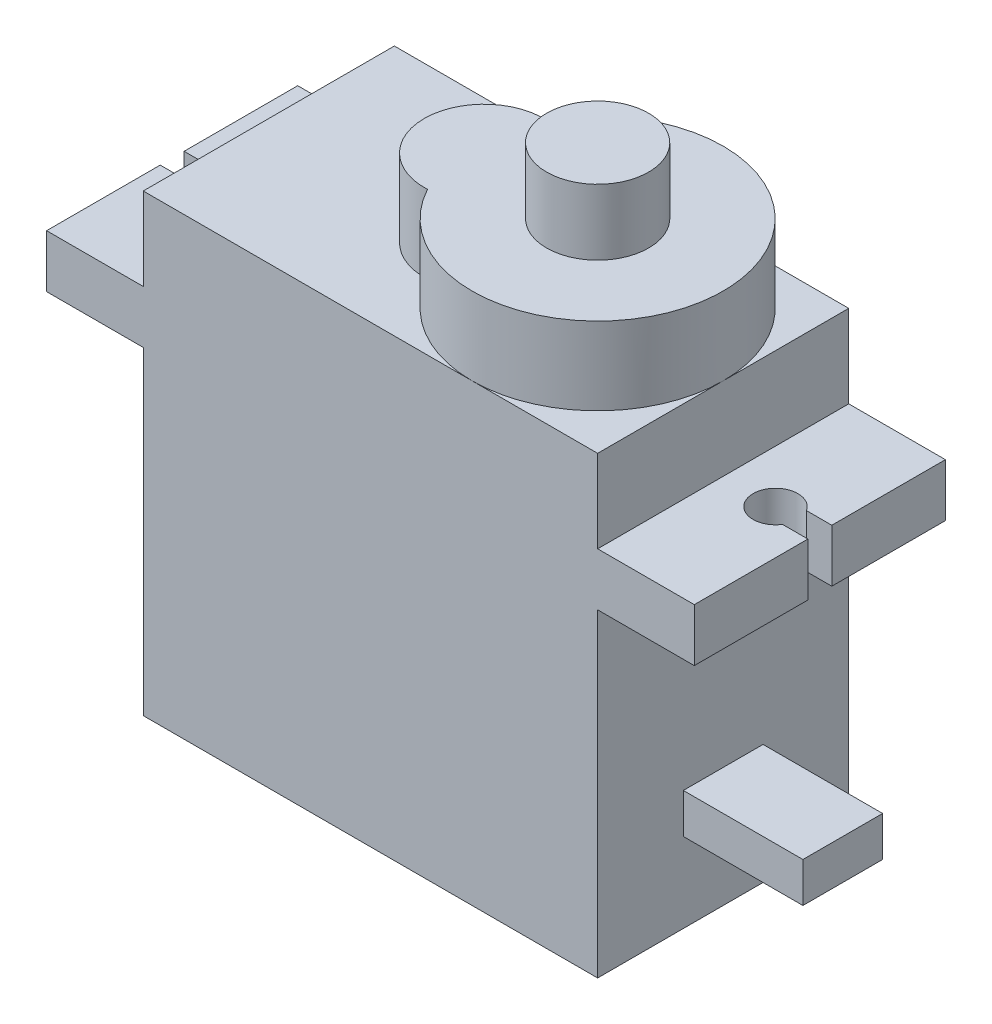
ISO-10303-21;
HEADER;
FILE_DESCRIPTION(('STEP AP214'),'2;1');
FILE_NAME('part.step','',(''),(''),'','','');
FILE_SCHEMA(('AUTOMOTIVE_DESIGN { 1 0 10303 214 1 1 1 1 }'));
ENDSEC;
DATA;
#1=APPLICATION_CONTEXT('core data for automotive mechanical design processes');
#2=APPLICATION_PROTOCOL_DEFINITION('international standard','automotive_design',2000,#1);
#3=PRODUCT_CONTEXT('',#1,'mechanical');
#4=PRODUCT('Part','Part','',(#3));
#5=PRODUCT_RELATED_PRODUCT_CATEGORY('part','',(#4));
#6=PRODUCT_DEFINITION_FORMATION('','',#4);
#7=PRODUCT_DEFINITION_CONTEXT('part definition',#1,'design');
#8=PRODUCT_DEFINITION('design','',#6,#7);
#9=PRODUCT_DEFINITION_SHAPE('','',#8);
#10=(LENGTH_UNIT() NAMED_UNIT(*) SI_UNIT(.MILLI.,.METRE.));
#11=(NAMED_UNIT(*) PLANE_ANGLE_UNIT() SI_UNIT($,.RADIAN.));
#12=(NAMED_UNIT(*) SI_UNIT($,.STERADIAN.) SOLID_ANGLE_UNIT());
#13=UNCERTAINTY_MEASURE_WITH_UNIT(LENGTH_MEASURE(1.E-05),#10,'distance_accuracy_value','');
#14=(GEOMETRIC_REPRESENTATION_CONTEXT(3) GLOBAL_UNCERTAINTY_ASSIGNED_CONTEXT((#13)) GLOBAL_UNIT_ASSIGNED_CONTEXT((#10,
#11,#12)) REPRESENTATION_CONTEXT('',''));
#15=CARTESIAN_POINT('',(0.,0.,0.));
#16=DIRECTION('',(0.,0.,1.));
#17=DIRECTION('',(1.,0.,0.));
#18=AXIS2_PLACEMENT_3D('',#15,#16,#17);
#19=CARTESIAN_POINT('',(11.4,16.,6.3));
#20=DIRECTION('',(-1.,0.,0.));
#21=DIRECTION('',(0.,-1.,0.));
#22=AXIS2_PLACEMENT_3D('',#19,#20,#21);
#23=PLANE('',#22);
#24=DIRECTION('',(0.,1.,0.));
#25=VECTOR('',#24,1.);
#26=CARTESIAN_POINT('',(11.4,16.,-6.3));
#27=LINE('',#26,#25);
#28=CARTESIAN_POINT('',(11.4,0.,-6.3));
#29=VERTEX_POINT('',#28);
#30=CARTESIAN_POINT('',(11.4,16.,-6.3));
#31=VERTEX_POINT('',#30);
#32=EDGE_CURVE('E363',#29,#31,#27,.T.);
#33=ORIENTED_EDGE('',*,*,#32,.T.);
#34=DIRECTION('',(0.,0.,-1.));
#35=VECTOR('',#34,1.);
#36=CARTESIAN_POINT('',(11.4,16.,6.3));
#37=LINE('',#36,#35);
#38=CARTESIAN_POINT('',(11.4,16.,6.3));
#39=VERTEX_POINT('',#38);
#40=EDGE_CURVE('E382',#39,#31,#37,.T.);
#41=ORIENTED_EDGE('',*,*,#40,.F.);
#42=DIRECTION('',(0.,1.,0.));
#43=VECTOR('',#42,1.);
#44=CARTESIAN_POINT('',(11.4,16.,6.3));
#45=LINE('',#44,#43);
#46=CARTESIAN_POINT('',(11.4,0.,6.3));
#47=VERTEX_POINT('',#46);
#48=EDGE_CURVE('E334',#47,#39,#45,.T.);
#49=ORIENTED_EDGE('',*,*,#48,.F.);
#50=DIRECTION('',(0.,0.,-1.));
#51=VECTOR('',#50,1.);
#52=CARTESIAN_POINT('',(11.4,0.,6.3));
#53=LINE('',#52,#51);
#54=EDGE_CURVE('E385',#47,#29,#53,.T.);
#55=ORIENTED_EDGE('',*,*,#54,.T.);
#56=EDGE_LOOP('',(#33,#41,#49,#55));
#57=FACE_BOUND('',#56,.T.);
#58=DIRECTION('',(0.,-1.,0.));
#59=VECTOR('',#58,1.);
#60=CARTESIAN_POINT('',(11.4,3.99999999999999,2.));
#61=LINE('',#60,#59);
#62=CARTESIAN_POINT('',(11.4,5.99999999999999,2.));
#63=VERTEX_POINT('',#62);
#64=CARTESIAN_POINT('',(11.4,3.99999999999999,2.));
#65=VERTEX_POINT('',#64);
#66=EDGE_CURVE('E238',#63,#65,#61,.T.);
#67=ORIENTED_EDGE('',*,*,#66,.F.);
#68=DIRECTION('',(0.,0.,1.));
#69=VECTOR('',#68,1.);
#70=CARTESIAN_POINT('',(11.4,5.99999999999999,2.));
#71=LINE('',#70,#69);
#72=CARTESIAN_POINT('',(11.4,5.99999999999999,-2.));
#73=VERTEX_POINT('',#72);
#74=EDGE_CURVE('E235',#73,#63,#71,.T.);
#75=ORIENTED_EDGE('',*,*,#74,.F.);
#76=DIRECTION('',(0.,1.,0.));
#77=VECTOR('',#76,1.);
#78=CARTESIAN_POINT('',(11.4,3.99999999999999,-2.));
#79=LINE('',#78,#77);
#80=CARTESIAN_POINT('',(11.4,3.99999999999999,-2.));
#81=VERTEX_POINT('',#80);
#82=EDGE_CURVE('E56',#81,#73,#79,.T.);
#83=ORIENTED_EDGE('',*,*,#82,.F.);
#84=DIRECTION('',(0.,0.,-1.));
#85=VECTOR('',#84,1.);
#86=CARTESIAN_POINT('',(11.4,3.99999999999999,2.));
#87=LINE('',#86,#85);
#88=EDGE_CURVE('E51',#65,#81,#87,.T.);
#89=ORIENTED_EDGE('',*,*,#88,.F.);
#90=EDGE_LOOP('',(#67,#75,#83,#89));
#91=FACE_BOUND('',#90,.T.);
#92=ADVANCED_FACE('F33',(#57,#91),#23,.F.);
#93=CARTESIAN_POINT('',(-16.25,18.65,6.3));
#94=DIRECTION('',(1.,0.,0.));
#95=DIRECTION('',(0.,0.,-1.));
#96=AXIS2_PLACEMENT_3D('',#93,#94,#95);
#97=PLANE('',#96);
#98=DIRECTION('',(0.,0.,-1.));
#99=VECTOR('',#98,1.);
#100=CARTESIAN_POINT('',(-16.25,18.65,6.3));
#101=LINE('',#100,#99);
#102=CARTESIAN_POINT('',(-16.25,18.65,6.3));
#103=VERTEX_POINT('',#102);
#104=CARTESIAN_POINT('',(-16.25,18.65,0.600000000000001));
#105=VERTEX_POINT('',#104);
#106=EDGE_CURVE('E399',#103,#105,#101,.T.);
#107=ORIENTED_EDGE('',*,*,#106,.T.);
#108=DIRECTION('',(0.,1.,0.));
#109=VECTOR('',#108,1.);
#110=CARTESIAN_POINT('',(-16.25,-0.00100000000000794,0.600000000000001));
#111=LINE('',#110,#109);
#112=CARTESIAN_POINT('',(-16.25,16.,0.600000000000001));
#113=VERTEX_POINT('',#112);
#114=EDGE_CURVE('E266',#113,#105,#111,.T.);
#115=ORIENTED_EDGE('',*,*,#114,.F.);
#116=DIRECTION('',(0.,0.,-1.));
#117=VECTOR('',#116,1.);
#118=CARTESIAN_POINT('',(-16.25,16.,6.3));
#119=LINE('',#118,#117);
#120=CARTESIAN_POINT('',(-16.25,16.,6.3));
#121=VERTEX_POINT('',#120);
#122=EDGE_CURVE('E395',#121,#113,#119,.T.);
#123=ORIENTED_EDGE('',*,*,#122,.F.);
#124=DIRECTION('',(0.,-1.,0.));
#125=VECTOR('',#124,1.);
#126=CARTESIAN_POINT('',(-16.25,18.65,6.3));
#127=LINE('',#126,#125);
#128=EDGE_CURVE('E326',#103,#121,#127,.T.);
#129=ORIENTED_EDGE('',*,*,#128,.F.);
#130=EDGE_LOOP('',(#107,#115,#123,#129));
#131=FACE_BOUND('',#130,.T.);
#132=ADVANCED_FACE('F521',(#131),#97,.F.);
#133=CARTESIAN_POINT('',(16.25,18.65,6.3));
#134=DIRECTION('',(-1.,0.,0.));
#135=DIRECTION('',(0.,0.,1.));
#136=AXIS2_PLACEMENT_3D('',#133,#134,#135);
#137=PLANE('',#136);
#138=DIRECTION('',(0.,0.,-1.));
#139=VECTOR('',#138,1.);
#140=CARTESIAN_POINT('',(16.25,18.65,6.3));
#141=LINE('',#140,#139);
#142=CARTESIAN_POINT('',(16.25,18.65,-0.6));
#143=VERTEX_POINT('',#142);
#144=CARTESIAN_POINT('',(16.25,18.65,-6.3));
#145=VERTEX_POINT('',#144);
#146=EDGE_CURVE('E374',#143,#145,#141,.T.);
#147=ORIENTED_EDGE('',*,*,#146,.F.);
#148=DIRECTION('',(0.,1.,0.));
#149=VECTOR('',#148,1.);
#150=CARTESIAN_POINT('',(16.25,-0.00100000000000794,-0.6));
#151=LINE('',#150,#149);
#152=CARTESIAN_POINT('',(16.25,16.,-0.6));
#153=VERTEX_POINT('',#152);
#154=EDGE_CURVE('E286',#153,#143,#151,.T.);
#155=ORIENTED_EDGE('',*,*,#154,.F.);
#156=DIRECTION('',(0.,0.,-1.));
#157=VECTOR('',#156,1.);
#158=CARTESIAN_POINT('',(16.25,16.,6.3));
#159=LINE('',#158,#157);
#160=CARTESIAN_POINT('',(16.25,16.,-6.3));
#161=VERTEX_POINT('',#160);
#162=EDGE_CURVE('E378',#153,#161,#159,.T.);
#163=ORIENTED_EDGE('',*,*,#162,.T.);
#164=DIRECTION('',(0.,1.,0.));
#165=VECTOR('',#164,1.);
#166=CARTESIAN_POINT('',(16.25,18.65,-6.3));
#167=LINE('',#166,#165);
#168=EDGE_CURVE('E368',#161,#145,#167,.T.);
#169=ORIENTED_EDGE('',*,*,#168,.T.);
#170=EDGE_LOOP('',(#147,#155,#163,#169));
#171=FACE_BOUND('',#170,.T.);
#172=ADVANCED_FACE('F437',(#171),#137,.F.);
#173=CARTESIAN_POINT('',(-11.4,22.8,6.3));
#174=DIRECTION('',(0.,-1.,0.));
#175=DIRECTION('',(0.,0.,-1.));
#176=AXIS2_PLACEMENT_3D('',#173,#174,#175);
#177=PLANE('',#176);
#178=CARTESIAN_POINT('',(-0.599999999999996,22.8,0.));
#179=DIRECTION('',(0.,1.,0.));
#180=DIRECTION('',(0.,0.,1.));
#181=AXIS2_PLACEMENT_3D('',#178,#179,#180);
#182=CIRCLE('',#181,3.);
#183=CARTESIAN_POINT('',(-0.442105263157892,22.8,-2.99584199384373));
#184=VERTEX_POINT('',#183);
#185=CARTESIAN_POINT('',(-0.442105263157893,22.8,2.99584199384372));
#186=VERTEX_POINT('',#185);
#187=EDGE_CURVE('E303',#184,#186,#182,.T.);
#188=ORIENTED_EDGE('',*,*,#187,.F.);
#189=CARTESIAN_POINT('',(5.1,22.8,0.));
#190=DIRECTION('',(0.,1.,0.));
#191=DIRECTION('',(0.,0.,1.));
#192=AXIS2_PLACEMENT_3D('',#189,#190,#191);
#193=CIRCLE('',#192,6.3);
#194=CARTESIAN_POINT('',(5.1,22.8,-6.3));
#195=VERTEX_POINT('',#194);
#196=EDGE_CURVE('E307',#195,#184,#193,.T.);
#197=ORIENTED_EDGE('',*,*,#196,.F.);
#198=DIRECTION('',(-1.,0.,0.));
#199=VECTOR('',#198,1.);
#200=CARTESIAN_POINT('',(-11.4,22.8,-6.3));
#201=LINE('',#200,#199);
#202=CARTESIAN_POINT('',(-11.4,22.8,-6.3));
#203=VERTEX_POINT('',#202);
#204=EDGE_CURVE('E345',#195,#203,#201,.T.);
#205=ORIENTED_EDGE('',*,*,#204,.T.);
#206=DIRECTION('',(0.,0.,-1.));
#207=VECTOR('',#206,1.);
#208=CARTESIAN_POINT('',(-11.4,22.8,6.3));
#209=LINE('',#208,#207);
#210=CARTESIAN_POINT('',(-11.4,22.8,6.3));
#211=VERTEX_POINT('',#210);
#212=EDGE_CURVE('E405',#211,#203,#209,.T.);
#213=ORIENTED_EDGE('',*,*,#212,.F.);
#214=DIRECTION('',(-1.,0.,0.));
#215=VECTOR('',#214,1.);
#216=CARTESIAN_POINT('',(-11.4,22.8,6.3));
#217=LINE('',#216,#215);
#218=CARTESIAN_POINT('',(5.1,22.8,6.3));
#219=VERTEX_POINT('',#218);
#220=EDGE_CURVE('E317',#219,#211,#217,.T.);
#221=ORIENTED_EDGE('',*,*,#220,.F.);
#222=EDGE_CURVE('E44',#186,#219,#193,.T.);
#223=ORIENTED_EDGE('',*,*,#222,.F.);
#224=EDGE_LOOP('',(#188,#197,#205,#213,#221,#223));
#225=FACE_BOUND('',#224,.T.);
#226=ADVANCED_FACE('F483',(#225),#177,.F.);
#227=CARTESIAN_POINT('',(11.4,22.8,0.));
#228=VERTEX_POINT('',#227);
#229=EDGE_CURVE('E11',#219,#228,#193,.T.);
#230=ORIENTED_EDGE('',*,*,#229,.F.);
#231=CARTESIAN_POINT('',(11.4,22.8,6.3));
#232=VERTEX_POINT('',#231);
#233=EDGE_CURVE('E319',#232,#219,#217,.T.);
#234=ORIENTED_EDGE('',*,*,#233,.F.);
#235=DIRECTION('',(0.,0.,-1.));
#236=VECTOR('',#235,1.);
#237=CARTESIAN_POINT('',(11.4,22.8,6.3));
#238=LINE('',#237,#236);
#239=EDGE_CURVE('E408',#232,#228,#238,.T.);
#240=ORIENTED_EDGE('',*,*,#239,.T.);
#241=EDGE_LOOP('',(#230,#234,#240));
#242=FACE_BOUND('',#241,.T.);
#243=ADVANCED_FACE('F493',(#242),#177,.F.);
#244=CARTESIAN_POINT('',(11.4,22.8,6.3));
#245=DIRECTION('',(-1.,0.,0.));
#246=DIRECTION('',(0.,-1.,0.));
#247=AXIS2_PLACEMENT_3D('',#244,#245,#246);
#248=PLANE('',#247);
#249=DIRECTION('',(0.,1.,0.));
#250=VECTOR('',#249,1.);
#251=CARTESIAN_POINT('',(11.4,22.8,-6.3));
#252=LINE('',#251,#250);
#253=CARTESIAN_POINT('',(11.4,18.65,-6.3));
#254=VERTEX_POINT('',#253);
#255=CARTESIAN_POINT('',(11.4,22.8,-6.3));
#256=VERTEX_POINT('',#255);
#257=EDGE_CURVE('E313',#254,#256,#252,.T.);
#258=ORIENTED_EDGE('',*,*,#257,.T.);
#259=EDGE_CURVE('E407',#228,#256,#238,.T.);
#260=ORIENTED_EDGE('',*,*,#259,.F.);
#261=ORIENTED_EDGE('',*,*,#239,.F.);
#262=DIRECTION('',(0.,1.,0.));
#263=VECTOR('',#262,1.);
#264=CARTESIAN_POINT('',(11.4,22.8,6.3));
#265=LINE('',#264,#263);
#266=CARTESIAN_POINT('',(11.4,18.65,6.3));
#267=VERTEX_POINT('',#266);
#268=EDGE_CURVE('E314',#267,#232,#265,.T.);
#269=ORIENTED_EDGE('',*,*,#268,.F.);
#270=DIRECTION('',(0.,0.,-1.));
#271=VECTOR('',#270,1.);
#272=CARTESIAN_POINT('',(11.4,18.65,6.3));
#273=LINE('',#272,#271);
#274=EDGE_CURVE('E342',#267,#254,#273,.T.);
#275=ORIENTED_EDGE('',*,*,#274,.T.);
#276=EDGE_LOOP('',(#258,#260,#261,#269,#275));
#277=FACE_BOUND('',#276,.T.);
#278=ADVANCED_FACE('F35',(#277),#248,.F.);
#279=EDGE_CURVE('E42',#228,#195,#193,.T.);
#280=ORIENTED_EDGE('',*,*,#279,.F.);
#281=ORIENTED_EDGE('',*,*,#259,.T.);
#282=EDGE_CURVE('E346',#256,#195,#201,.T.);
#283=ORIENTED_EDGE('',*,*,#282,.T.);
#284=EDGE_LOOP('',(#280,#281,#283));
#285=FACE_BOUND('',#284,.T.);
#286=ADVANCED_FACE('F416',(#285),#177,.F.);
#287=CARTESIAN_POINT('',(-11.4,22.8,6.3));
#288=DIRECTION('',(1.,0.,0.));
#289=DIRECTION('',(0.,1.,0.));
#290=AXIS2_PLACEMENT_3D('',#287,#288,#289);
#291=PLANE('',#290);
#292=DIRECTION('',(0.,-1.,0.));
#293=VECTOR('',#292,1.);
#294=CARTESIAN_POINT('',(-11.4,22.8,-6.3));
#295=LINE('',#294,#293);
#296=CARTESIAN_POINT('',(-11.4,18.65,-6.3));
#297=VERTEX_POINT('',#296);
#298=EDGE_CURVE('E349',#203,#297,#295,.T.);
#299=ORIENTED_EDGE('',*,*,#298,.T.);
#300=DIRECTION('',(0.,0.,-1.));
#301=VECTOR('',#300,1.);
#302=CARTESIAN_POINT('',(-11.4,18.65,6.3));
#303=LINE('',#302,#301);
#304=CARTESIAN_POINT('',(-11.4,18.65,6.3));
#305=VERTEX_POINT('',#304);
#306=EDGE_CURVE('E402',#305,#297,#303,.T.);
#307=ORIENTED_EDGE('',*,*,#306,.F.);
#308=DIRECTION('',(0.,-1.,0.));
#309=VECTOR('',#308,1.);
#310=CARTESIAN_POINT('',(-11.4,22.8,6.3));
#311=LINE('',#310,#309);
#312=EDGE_CURVE('E322',#211,#305,#311,.T.);
#313=ORIENTED_EDGE('',*,*,#312,.F.);
#314=ORIENTED_EDGE('',*,*,#212,.T.);
#315=EDGE_LOOP('',(#299,#307,#313,#314));
#316=FACE_BOUND('',#315,.T.);
#317=ADVANCED_FACE('F479',(#316),#291,.F.);
#318=CARTESIAN_POINT('',(-11.4,18.65,6.3));
#319=DIRECTION('',(0.,-1.,0.));
#320=DIRECTION('',(0.,0.,-1.));
#321=AXIS2_PLACEMENT_3D('',#318,#319,#320);
#322=PLANE('',#321);
#323=CARTESIAN_POINT('',(-14.025,18.65,0.));
#324=DIRECTION('',(0.,1.,0.));
#325=DIRECTION('',(0.,0.,1.));
#326=AXIS2_PLACEMENT_3D('',#323,#324,#325);
#327=CIRCLE('',#326,1.125);
#328=CARTESIAN_POINT('',(-14.9766433155337,18.65,0.600000000000001));
#329=VERTEX_POINT('',#328);
#330=CARTESIAN_POINT('',(-14.9766433155337,18.65,-0.6));
#331=VERTEX_POINT('',#330);
#332=EDGE_CURVE('E254',#329,#331,#327,.T.);
#333=ORIENTED_EDGE('',*,*,#332,.F.);
#334=DIRECTION('',(1.,0.,0.));
#335=VECTOR('',#334,1.);
#336=CARTESIAN_POINT('',(-14.9766433155337,18.65,0.600000000000001));
#337=LINE('',#336,#335);
#338=EDGE_CURVE('E259',#105,#329,#337,.T.);
#339=ORIENTED_EDGE('',*,*,#338,.F.);
#340=ORIENTED_EDGE('',*,*,#106,.F.);
#341=DIRECTION('',(-1.,0.,0.));
#342=VECTOR('',#341,1.);
#343=CARTESIAN_POINT('',(-11.4,18.65,6.3));
#344=LINE('',#343,#342);
#345=EDGE_CURVE('E324',#305,#103,#344,.T.);
#346=ORIENTED_EDGE('',*,*,#345,.F.);
#347=ORIENTED_EDGE('',*,*,#306,.T.);
#348=DIRECTION('',(-1.,0.,0.));
#349=VECTOR('',#348,1.);
#350=CARTESIAN_POINT('',(-11.4,18.65,-6.3));
#351=LINE('',#350,#349);
#352=CARTESIAN_POINT('',(-16.25,18.65,-6.3));
#353=VERTEX_POINT('',#352);
#354=EDGE_CURVE('E351',#297,#353,#351,.T.);
#355=ORIENTED_EDGE('',*,*,#354,.T.);
#356=CARTESIAN_POINT('',(-16.25,18.65,-0.6));
#357=VERTEX_POINT('',#356);
#358=EDGE_CURVE('E398',#357,#353,#101,.T.);
#359=ORIENTED_EDGE('',*,*,#358,.F.);
#360=DIRECTION('',(-1.,0.,0.));
#361=VECTOR('',#360,1.);
#362=CARTESIAN_POINT('',(-14.9766433155337,18.65,-0.6));
#363=LINE('',#362,#361);
#364=EDGE_CURVE('E257',#331,#357,#363,.T.);
#365=ORIENTED_EDGE('',*,*,#364,.F.);
#366=EDGE_LOOP('',(#333,#339,#340,#346,#347,#355,#359,#365));
#367=FACE_BOUND('',#366,.T.);
#368=ADVANCED_FACE('F473',(#367),#322,.F.);
#369=CARTESIAN_POINT('',(-16.25,16.,-0.6));
#370=VERTEX_POINT('',#369);
#371=CARTESIAN_POINT('',(-16.25,16.,-6.3));
#372=VERTEX_POINT('',#371);
#373=EDGE_CURVE('E394',#370,#372,#119,.T.);
#374=ORIENTED_EDGE('',*,*,#373,.F.);
#375=DIRECTION('',(0.,1.,0.));
#376=VECTOR('',#375,1.);
#377=CARTESIAN_POINT('',(-16.25,-0.00100000000000794,-0.6));
#378=LINE('',#377,#376);
#379=EDGE_CURVE('E268',#370,#357,#378,.T.);
#380=ORIENTED_EDGE('',*,*,#379,.T.);
#381=ORIENTED_EDGE('',*,*,#358,.T.);
#382=DIRECTION('',(0.,-1.,0.));
#383=VECTOR('',#382,1.);
#384=CARTESIAN_POINT('',(-16.25,18.65,-6.3));
#385=LINE('',#384,#383);
#386=EDGE_CURVE('E354',#353,#372,#385,.T.);
#387=ORIENTED_EDGE('',*,*,#386,.T.);
#388=EDGE_LOOP('',(#374,#380,#381,#387));
#389=FACE_BOUND('',#388,.T.);
#390=ADVANCED_FACE('F468',(#389),#97,.F.);
#391=CARTESIAN_POINT('',(-16.25,16.,6.3));
#392=DIRECTION('',(0.,1.,0.));
#393=DIRECTION('',(-1.,0.,0.));
#394=AXIS2_PLACEMENT_3D('',#391,#392,#393);
#395=PLANE('',#394);
#396=ORIENTED_EDGE('',*,*,#122,.T.);
#397=DIRECTION('',(-1.,0.,0.));
#398=VECTOR('',#397,1.);
#399=CARTESIAN_POINT('',(-14.9766433155337,16.,0.600000000000001));
#400=LINE('',#399,#398);
#401=CARTESIAN_POINT('',(-14.9766433155337,16.,0.600000000000001));
#402=VERTEX_POINT('',#401);
#403=EDGE_CURVE('E251',#402,#113,#400,.T.);
#404=ORIENTED_EDGE('',*,*,#403,.F.);
#405=CARTESIAN_POINT('',(-14.025,16.,0.));
#406=DIRECTION('',(0.,1.,0.));
#407=DIRECTION('',(-1.,0.,0.));
#408=AXIS2_PLACEMENT_3D('',#405,#406,#407);
#409=CIRCLE('',#408,1.125);
#410=CARTESIAN_POINT('',(-14.9766433155337,16.,-0.6));
#411=VERTEX_POINT('',#410);
#412=EDGE_CURVE('E248',#411,#402,#409,.F.);
#413=ORIENTED_EDGE('',*,*,#412,.F.);
#414=DIRECTION('',(1.,0.,0.));
#415=VECTOR('',#414,1.);
#416=CARTESIAN_POINT('',(-14.9766433155337,16.,-0.6));
#417=LINE('',#416,#415);
#418=EDGE_CURVE('E265',#370,#411,#417,.T.);
#419=ORIENTED_EDGE('',*,*,#418,.F.);
#420=ORIENTED_EDGE('',*,*,#373,.T.);
#421=DIRECTION('',(1.,0.,0.));
#422=VECTOR('',#421,1.);
#423=CARTESIAN_POINT('',(-16.25,16.,-6.3));
#424=LINE('',#423,#422);
#425=CARTESIAN_POINT('',(-11.4,16.,-6.3));
#426=VERTEX_POINT('',#425);
#427=EDGE_CURVE('E357',#372,#426,#424,.T.);
#428=ORIENTED_EDGE('',*,*,#427,.T.);
#429=DIRECTION('',(0.,0.,-1.));
#430=VECTOR('',#429,1.);
#431=CARTESIAN_POINT('',(-11.4,16.,6.3));
#432=LINE('',#431,#430);
#433=CARTESIAN_POINT('',(-11.4,16.,6.3));
#434=VERTEX_POINT('',#433);
#435=EDGE_CURVE('E391',#434,#426,#432,.T.);
#436=ORIENTED_EDGE('',*,*,#435,.F.);
#437=DIRECTION('',(1.,0.,0.));
#438=VECTOR('',#437,1.);
#439=CARTESIAN_POINT('',(-16.25,16.,6.3));
#440=LINE('',#439,#438);
#441=EDGE_CURVE('E328',#121,#434,#440,.T.);
#442=ORIENTED_EDGE('',*,*,#441,.F.);
#443=EDGE_LOOP('',(#396,#404,#413,#419,#420,#428,#436,#442));
#444=FACE_BOUND('',#443,.T.);
#445=ADVANCED_FACE('F462',(#444),#395,.F.);
#446=CARTESIAN_POINT('',(-11.4,16.,6.3));
#447=DIRECTION('',(1.,0.,0.));
#448=DIRECTION('',(0.,1.,0.));
#449=AXIS2_PLACEMENT_3D('',#446,#447,#448);
#450=PLANE('',#449);
#451=DIRECTION('',(0.,-1.,0.));
#452=VECTOR('',#451,1.);
#453=CARTESIAN_POINT('',(-11.4,16.,-6.3));
#454=LINE('',#453,#452);
#455=CARTESIAN_POINT('',(-11.4,0.,-6.3));
#456=VERTEX_POINT('',#455);
#457=EDGE_CURVE('E359',#426,#456,#454,.T.);
#458=ORIENTED_EDGE('',*,*,#457,.T.);
#459=DIRECTION('',(0.,0.,-1.));
#460=VECTOR('',#459,1.);
#461=CARTESIAN_POINT('',(-11.4,0.,6.3));
#462=LINE('',#461,#460);
#463=CARTESIAN_POINT('',(-11.4,0.,6.3));
#464=VERTEX_POINT('',#463);
#465=EDGE_CURVE('E388',#464,#456,#462,.T.);
#466=ORIENTED_EDGE('',*,*,#465,.F.);
#467=DIRECTION('',(0.,-1.,0.));
#468=VECTOR('',#467,1.);
#469=CARTESIAN_POINT('',(-11.4,16.,6.3));
#470=LINE('',#469,#468);
#471=EDGE_CURVE('E330',#434,#464,#470,.T.);
#472=ORIENTED_EDGE('',*,*,#471,.F.);
#473=ORIENTED_EDGE('',*,*,#435,.T.);
#474=EDGE_LOOP('',(#458,#466,#472,#473));
#475=FACE_BOUND('',#474,.T.);
#476=ADVANCED_FACE('F458',(#475),#450,.F.);
#477=CARTESIAN_POINT('',(11.4,0.,6.3));
#478=DIRECTION('',(0.,1.,0.));
#479=DIRECTION('',(0.,0.,1.));
#480=AXIS2_PLACEMENT_3D('',#477,#478,#479);
#481=PLANE('',#480);
#482=DIRECTION('',(1.,0.,0.));
#483=VECTOR('',#482,1.);
#484=CARTESIAN_POINT('',(11.4,0.,-6.3));
#485=LINE('',#484,#483);
#486=EDGE_CURVE('E361',#456,#29,#485,.T.);
#487=ORIENTED_EDGE('',*,*,#486,.T.);
#488=ORIENTED_EDGE('',*,*,#54,.F.);
#489=DIRECTION('',(1.,0.,0.));
#490=VECTOR('',#489,1.);
#491=CARTESIAN_POINT('',(11.4,0.,6.3));
#492=LINE('',#491,#490);
#493=EDGE_CURVE('E332',#464,#47,#492,.T.);
#494=ORIENTED_EDGE('',*,*,#493,.F.);
#495=ORIENTED_EDGE('',*,*,#465,.T.);
#496=EDGE_LOOP('',(#487,#488,#494,#495));
#497=FACE_BOUND('',#496,.T.);
#498=ADVANCED_FACE('F453',(#497),#481,.F.);
#499=CARTESIAN_POINT('',(16.25,16.,6.3));
#500=DIRECTION('',(0.,1.,0.));
#501=DIRECTION('',(-1.,0.,0.));
#502=AXIS2_PLACEMENT_3D('',#499,#500,#501);
#503=PLANE('',#502);
#504=ORIENTED_EDGE('',*,*,#162,.F.);
#505=DIRECTION('',(1.,0.,0.));
#506=VECTOR('',#505,1.);
#507=CARTESIAN_POINT('',(14.9766433155337,16.,-0.6));
#508=LINE('',#507,#506);
#509=CARTESIAN_POINT('',(14.9766433155337,16.,-0.6));
#510=VERTEX_POINT('',#509);
#511=EDGE_CURVE('E242',#510,#153,#508,.T.);
#512=ORIENTED_EDGE('',*,*,#511,.F.);
#513=CARTESIAN_POINT('',(14.025,16.,0.));
#514=DIRECTION('',(0.,1.,0.));
#515=DIRECTION('',(-1.,0.,0.));
#516=AXIS2_PLACEMENT_3D('',#513,#514,#515);
#517=CIRCLE('',#516,1.125);
#518=CARTESIAN_POINT('',(14.9766433155337,16.,0.600000000000001));
#519=VERTEX_POINT('',#518);
#520=EDGE_CURVE('E239',#519,#510,#517,.F.);
#521=ORIENTED_EDGE('',*,*,#520,.F.);
#522=DIRECTION('',(-1.,0.,0.));
#523=VECTOR('',#522,1.);
#524=CARTESIAN_POINT('',(14.9766433155337,16.,0.600000000000001));
#525=LINE('',#524,#523);
#526=CARTESIAN_POINT('',(16.25,16.,0.600000000000001));
#527=VERTEX_POINT('',#526);
#528=EDGE_CURVE('E252',#527,#519,#525,.T.);
#529=ORIENTED_EDGE('',*,*,#528,.F.);
#530=CARTESIAN_POINT('',(16.25,16.,6.3));
#531=VERTEX_POINT('',#530);
#532=EDGE_CURVE('E379',#531,#527,#159,.T.);
#533=ORIENTED_EDGE('',*,*,#532,.F.);
#534=DIRECTION('',(1.,0.,0.));
#535=VECTOR('',#534,1.);
#536=CARTESIAN_POINT('',(16.25,16.,6.3));
#537=LINE('',#536,#535);
#538=EDGE_CURVE('E336',#39,#531,#537,.T.);
#539=ORIENTED_EDGE('',*,*,#538,.F.);
#540=ORIENTED_EDGE('',*,*,#40,.T.);
#541=DIRECTION('',(1.,0.,0.));
#542=VECTOR('',#541,1.);
#543=CARTESIAN_POINT('',(16.25,16.,-6.3));
#544=LINE('',#543,#542);
#545=EDGE_CURVE('E365',#31,#161,#544,.T.);
#546=ORIENTED_EDGE('',*,*,#545,.T.);
#547=EDGE_LOOP('',(#504,#512,#521,#529,#533,#539,#540,#546));
#548=FACE_BOUND('',#547,.T.);
#549=ADVANCED_FACE('F442',(#548),#503,.F.);
#550=ORIENTED_EDGE('',*,*,#532,.T.);
#551=DIRECTION('',(0.,1.,0.));
#552=VECTOR('',#551,1.);
#553=CARTESIAN_POINT('',(16.25,-0.00100000000000794,0.600000000000001));
#554=LINE('',#553,#552);
#555=CARTESIAN_POINT('',(16.25,18.65,0.600000000000001));
#556=VERTEX_POINT('',#555);
#557=EDGE_CURVE('E288',#527,#556,#554,.T.);
#558=ORIENTED_EDGE('',*,*,#557,.T.);
#559=CARTESIAN_POINT('',(16.25,18.65,6.3));
#560=VERTEX_POINT('',#559);
#561=EDGE_CURVE('E375',#560,#556,#141,.T.);
#562=ORIENTED_EDGE('',*,*,#561,.F.);
#563=DIRECTION('',(0.,1.,0.));
#564=VECTOR('',#563,1.);
#565=CARTESIAN_POINT('',(16.25,18.65,6.3));
#566=LINE('',#565,#564);
#567=EDGE_CURVE('E338',#531,#560,#566,.T.);
#568=ORIENTED_EDGE('',*,*,#567,.F.);
#569=EDGE_LOOP('',(#550,#558,#562,#568));
#570=FACE_BOUND('',#569,.T.);
#571=ADVANCED_FACE('F499',(#570),#137,.F.);
#572=CARTESIAN_POINT('',(11.4,18.65,6.3));
#573=DIRECTION('',(0.,-1.,0.));
#574=DIRECTION('',(0.,0.,-1.));
#575=AXIS2_PLACEMENT_3D('',#572,#573,#574);
#576=PLANE('',#575);
#577=CARTESIAN_POINT('',(14.025,18.65,0.));
#578=DIRECTION('',(0.,1.,0.));
#579=DIRECTION('',(0.,0.,-1.));
#580=AXIS2_PLACEMENT_3D('',#577,#578,#579);
#581=CIRCLE('',#580,1.125);
#582=CARTESIAN_POINT('',(14.9766433155337,18.65,-0.6));
#583=VERTEX_POINT('',#582);
#584=CARTESIAN_POINT('',(14.9766433155337,18.65,0.600000000000001));
#585=VERTEX_POINT('',#584);
#586=EDGE_CURVE('E276',#583,#585,#581,.T.);
#587=ORIENTED_EDGE('',*,*,#586,.F.);
#588=DIRECTION('',(-1.,0.,0.));
#589=VECTOR('',#588,1.);
#590=CARTESIAN_POINT('',(14.9766433155337,18.65,-0.6));
#591=LINE('',#590,#589);
#592=EDGE_CURVE('E280',#143,#583,#591,.T.);
#593=ORIENTED_EDGE('',*,*,#592,.F.);
#594=ORIENTED_EDGE('',*,*,#146,.T.);
#595=DIRECTION('',(-1.,0.,0.));
#596=VECTOR('',#595,1.);
#597=CARTESIAN_POINT('',(11.4,18.65,-6.3));
#598=LINE('',#597,#596);
#599=EDGE_CURVE('E318',#145,#254,#598,.T.);
#600=ORIENTED_EDGE('',*,*,#599,.T.);
#601=ORIENTED_EDGE('',*,*,#274,.F.);
#602=DIRECTION('',(-1.,0.,0.));
#603=VECTOR('',#602,1.);
#604=CARTESIAN_POINT('',(11.4,18.65,6.3));
#605=LINE('',#604,#603);
#606=EDGE_CURVE('E340',#560,#267,#605,.T.);
#607=ORIENTED_EDGE('',*,*,#606,.F.);
#608=ORIENTED_EDGE('',*,*,#561,.T.);
#609=DIRECTION('',(1.,0.,0.));
#610=VECTOR('',#609,1.);
#611=CARTESIAN_POINT('',(14.9766433155337,18.65,0.600000000000001));
#612=LINE('',#611,#610);
#613=EDGE_CURVE('E278',#585,#556,#612,.T.);
#614=ORIENTED_EDGE('',*,*,#613,.F.);
#615=EDGE_LOOP('',(#587,#593,#594,#600,#601,#607,#608,#614));
#616=FACE_BOUND('',#615,.T.);
#617=ADVANCED_FACE('F430',(#616),#576,.F.);
#618=CARTESIAN_POINT('',(0.,0.,6.3));
#619=DIRECTION('',(0.,0.,1.));
#620=DIRECTION('',(1.,0.,0.));
#621=AXIS2_PLACEMENT_3D('',#618,#619,#620);
#622=PLANE('',#621);
#623=ORIENTED_EDGE('',*,*,#268,.T.);
#624=ORIENTED_EDGE('',*,*,#233,.T.);
#625=ORIENTED_EDGE('',*,*,#220,.T.);
#626=ORIENTED_EDGE('',*,*,#312,.T.);
#627=ORIENTED_EDGE('',*,*,#345,.T.);
#628=ORIENTED_EDGE('',*,*,#128,.T.);
#629=ORIENTED_EDGE('',*,*,#441,.T.);
#630=ORIENTED_EDGE('',*,*,#471,.T.);
#631=ORIENTED_EDGE('',*,*,#493,.T.);
#632=ORIENTED_EDGE('',*,*,#48,.T.);
#633=ORIENTED_EDGE('',*,*,#538,.T.);
#634=ORIENTED_EDGE('',*,*,#567,.T.);
#635=ORIENTED_EDGE('',*,*,#606,.T.);
#636=EDGE_LOOP('',(#623,#624,#625,#626,#627,#628,#629,#630,#631,#632,#633,#634,#635));
#637=FACE_BOUND('',#636,.T.);
#638=ADVANCED_FACE('F495',(#637),#622,.T.);
#639=CARTESIAN_POINT('',(0.,0.,-6.3));
#640=DIRECTION('',(0.,0.,1.));
#641=DIRECTION('',(1.,0.,0.));
#642=AXIS2_PLACEMENT_3D('',#639,#640,#641);
#643=PLANE('',#642);
#644=ORIENTED_EDGE('',*,*,#257,.F.);
#645=ORIENTED_EDGE('',*,*,#599,.F.);
#646=ORIENTED_EDGE('',*,*,#168,.F.);
#647=ORIENTED_EDGE('',*,*,#545,.F.);
#648=ORIENTED_EDGE('',*,*,#32,.F.);
#649=ORIENTED_EDGE('',*,*,#486,.F.);
#650=ORIENTED_EDGE('',*,*,#457,.F.);
#651=ORIENTED_EDGE('',*,*,#427,.F.);
#652=ORIENTED_EDGE('',*,*,#386,.F.);
#653=ORIENTED_EDGE('',*,*,#354,.F.);
#654=ORIENTED_EDGE('',*,*,#298,.F.);
#655=ORIENTED_EDGE('',*,*,#204,.F.);
#656=ORIENTED_EDGE('',*,*,#282,.F.);
#657=EDGE_LOOP('',(#644,#645,#646,#647,#648,#649,#650,#651,#652,#653,#654,#655,#656));
#658=FACE_BOUND('',#657,.T.);
#659=ADVANCED_FACE('F422',(#658),#643,.F.);
#660=CARTESIAN_POINT('',(-0.599999999999996,26.7,0.));
#661=DIRECTION('',(0.,-1.,0.));
#662=DIRECTION('',(0.,0.,-1.));
#663=AXIS2_PLACEMENT_3D('',#660,#661,#662);
#664=CYLINDRICAL_SURFACE('',#663,3.);
#665=ORIENTED_EDGE('',*,*,#187,.T.);
#666=DIRECTION('',(0.,-1.,0.));
#667=VECTOR('',#666,1.);
#668=CARTESIAN_POINT('',(-0.442105263157893,26.7,2.99584199384372));
#669=LINE('',#668,#667);
#670=CARTESIAN_POINT('',(-0.442105263157893,26.7,2.99584199384372));
#671=VERTEX_POINT('',#670);
#672=EDGE_CURVE('E310',#671,#186,#669,.T.);
#673=ORIENTED_EDGE('',*,*,#672,.F.);
#674=CARTESIAN_POINT('',(-0.599999999999996,26.7,0.));
#675=DIRECTION('',(0.,1.,0.));
#676=DIRECTION('',(0.,0.,1.));
#677=AXIS2_PLACEMENT_3D('',#674,#675,#676);
#678=CIRCLE('',#677,3.);
#679=CARTESIAN_POINT('',(-0.442105263157892,26.7,-2.99584199384373));
#680=VERTEX_POINT('',#679);
#681=EDGE_CURVE('E297',#680,#671,#678,.T.);
#682=ORIENTED_EDGE('',*,*,#681,.F.);
#683=DIRECTION('',(0.,-1.,0.));
#684=VECTOR('',#683,1.);
#685=CARTESIAN_POINT('',(-0.442105263157892,26.7,-2.99584199384373));
#686=LINE('',#685,#684);
#687=EDGE_CURVE('E302',#680,#184,#686,.T.);
#688=ORIENTED_EDGE('',*,*,#687,.T.);
#689=EDGE_LOOP('',(#665,#673,#682,#688));
#690=FACE_BOUND('',#689,.T.);
#691=ADVANCED_FACE('F489',(#690),#664,.T.);
#692=CARTESIAN_POINT('',(5.1,26.7,0.));
#693=DIRECTION('',(0.,-1.,0.));
#694=DIRECTION('',(0.,0.,-1.));
#695=AXIS2_PLACEMENT_3D('',#692,#693,#694);
#696=CYLINDRICAL_SURFACE('',#695,6.3);
#697=ORIENTED_EDGE('',*,*,#222,.T.);
#698=ORIENTED_EDGE('',*,*,#229,.T.);
#699=ORIENTED_EDGE('',*,*,#279,.T.);
#700=ORIENTED_EDGE('',*,*,#196,.T.);
#701=ORIENTED_EDGE('',*,*,#687,.F.);
#702=CARTESIAN_POINT('',(5.1,26.7,0.));
#703=DIRECTION('',(0.,1.,0.));
#704=DIRECTION('',(0.,0.,1.));
#705=AXIS2_PLACEMENT_3D('',#702,#703,#704);
#706=CIRCLE('',#705,6.3);
#707=EDGE_CURVE('E300',#671,#680,#706,.T.);
#708=ORIENTED_EDGE('',*,*,#707,.F.);
#709=ORIENTED_EDGE('',*,*,#672,.T.);
#710=EDGE_LOOP('',(#697,#698,#699,#700,#701,#708,#709));
#711=FACE_BOUND('',#710,.T.);
#712=ADVANCED_FACE('F486',(#711),#696,.T.);
#713=CARTESIAN_POINT('',(2.25,26.7,0.));
#714=DIRECTION('',(0.,1.,0.));
#715=DIRECTION('',(0.,0.,1.));
#716=AXIS2_PLACEMENT_3D('',#713,#714,#715);
#717=PLANE('',#716);
#718=CARTESIAN_POINT('',(5.1,26.7,0.));
#719=DIRECTION('',(0.,1.,0.));
#720=DIRECTION('',(0.,0.,1.));
#721=AXIS2_PLACEMENT_3D('',#718,#719,#720);
#722=CIRCLE('',#721,2.56);
#723=CARTESIAN_POINT('',(5.1,26.7,2.56));
#724=VERTEX_POINT('',#723);
#725=EDGE_CURVE('E37',#724,#724,#722,.F.);
#726=ORIENTED_EDGE('',*,*,#725,.T.);
#727=EDGE_LOOP('',(#726));
#728=FACE_BOUND('',#727,.T.);
#729=ORIENTED_EDGE('',*,*,#681,.T.);
#730=ORIENTED_EDGE('',*,*,#707,.T.);
#731=EDGE_LOOP('',(#729,#730));
#732=FACE_BOUND('',#731,.T.);
#733=ADVANCED_FACE('F492',(#728,#732),#717,.T.);
#734=CARTESIAN_POINT('',(5.1,30.,0.));
#735=DIRECTION('',(0.,-1.,0.));
#736=DIRECTION('',(0.,0.,-1.));
#737=AXIS2_PLACEMENT_3D('',#734,#735,#736);
#738=CYLINDRICAL_SURFACE('',#737,2.56);
#739=ORIENTED_EDGE('',*,*,#725,.F.);
#740=EDGE_LOOP('',(#739));
#741=FACE_BOUND('',#740,.T.);
#742=CARTESIAN_POINT('',(5.1,30.,0.));
#743=DIRECTION('',(0.,1.,0.));
#744=DIRECTION('',(0.,0.,1.));
#745=AXIS2_PLACEMENT_3D('',#742,#743,#744);
#746=CIRCLE('',#745,2.56);
#747=CARTESIAN_POINT('',(5.1,30.,2.56));
#748=VERTEX_POINT('',#747);
#749=EDGE_CURVE('E273',#748,#748,#746,.T.);
#750=ORIENTED_EDGE('',*,*,#749,.F.);
#751=EDGE_LOOP('',(#750));
#752=FACE_BOUND('',#751,.T.);
#753=ADVANCED_FACE('F614',(#741,#752),#738,.T.);
#754=CARTESIAN_POINT('',(5.1,30.,0.));
#755=DIRECTION('',(0.,1.,0.));
#756=DIRECTION('',(0.,0.,1.));
#757=AXIS2_PLACEMENT_3D('',#754,#755,#756);
#758=PLANE('',#757);
#759=ORIENTED_EDGE('',*,*,#749,.T.);
#760=EDGE_LOOP('',(#759));
#761=FACE_BOUND('',#760,.T.);
#762=ADVANCED_FACE('F517',(#761),#758,.T.);
#763=CARTESIAN_POINT('',(14.025,-0.00100000000000794,0.));
#764=DIRECTION('',(0.,1.,0.));
#765=DIRECTION('',(0.,0.,1.));
#766=AXIS2_PLACEMENT_3D('',#763,#764,#765);
#767=CYLINDRICAL_SURFACE('',#766,1.125);
#768=ORIENTED_EDGE('',*,*,#520,.T.);
#769=DIRECTION('',(0.,1.,0.));
#770=VECTOR('',#769,1.);
#771=CARTESIAN_POINT('',(14.9766433155337,-0.00100000000000794,-0.6));
#772=LINE('',#771,#770);
#773=EDGE_CURVE('E284',#510,#583,#772,.T.);
#774=ORIENTED_EDGE('',*,*,#773,.T.);
#775=ORIENTED_EDGE('',*,*,#586,.T.);
#776=DIRECTION('',(0.,1.,0.));
#777=VECTOR('',#776,1.);
#778=CARTESIAN_POINT('',(14.9766433155337,-0.00100000000000794,0.600000000000001));
#779=LINE('',#778,#777);
#780=EDGE_CURVE('E283',#519,#585,#779,.T.);
#781=ORIENTED_EDGE('',*,*,#780,.F.);
#782=EDGE_LOOP('',(#768,#774,#775,#781));
#783=FACE_BOUND('',#782,.T.);
#784=ADVANCED_FACE('F506',(#783),#767,.F.);
#785=CARTESIAN_POINT('',(14.9766433155337,-0.00100000000000794,-0.6));
#786=DIRECTION('',(0.,0.,-1.));
#787=DIRECTION('',(-1.,0.,0.));
#788=AXIS2_PLACEMENT_3D('',#785,#786,#787);
#789=PLANE('',#788);
#790=ORIENTED_EDGE('',*,*,#511,.T.);
#791=ORIENTED_EDGE('',*,*,#154,.T.);
#792=ORIENTED_EDGE('',*,*,#592,.T.);
#793=ORIENTED_EDGE('',*,*,#773,.F.);
#794=EDGE_LOOP('',(#790,#791,#792,#793));
#795=FACE_BOUND('',#794,.T.);
#796=ADVANCED_FACE('F508',(#795),#789,.F.);
#797=CARTESIAN_POINT('',(14.9766433155337,-0.00100000000000794,0.600000000000001));
#798=DIRECTION('',(0.,0.,1.));
#799=DIRECTION('',(1.,0.,0.));
#800=AXIS2_PLACEMENT_3D('',#797,#798,#799);
#801=PLANE('',#800);
#802=ORIENTED_EDGE('',*,*,#528,.T.);
#803=ORIENTED_EDGE('',*,*,#780,.T.);
#804=ORIENTED_EDGE('',*,*,#613,.T.);
#805=ORIENTED_EDGE('',*,*,#557,.F.);
#806=EDGE_LOOP('',(#802,#803,#804,#805));
#807=FACE_BOUND('',#806,.T.);
#808=ADVANCED_FACE('F502',(#807),#801,.F.);
#809=CARTESIAN_POINT('',(-14.025,-0.00100000000000794,0.));
#810=DIRECTION('',(0.,1.,0.));
#811=DIRECTION('',(0.,0.,1.));
#812=AXIS2_PLACEMENT_3D('',#809,#810,#811);
#813=CYLINDRICAL_SURFACE('',#812,1.125);
#814=ORIENTED_EDGE('',*,*,#412,.T.);
#815=DIRECTION('',(0.,1.,0.));
#816=VECTOR('',#815,1.);
#817=CARTESIAN_POINT('',(-14.9766433155337,-0.00100000000000794,0.600000000000001));
#818=LINE('',#817,#816);
#819=EDGE_CURVE('E263',#402,#329,#818,.T.);
#820=ORIENTED_EDGE('',*,*,#819,.T.);
#821=ORIENTED_EDGE('',*,*,#332,.T.);
#822=DIRECTION('',(0.,1.,0.));
#823=VECTOR('',#822,1.);
#824=CARTESIAN_POINT('',(-14.9766433155337,-0.00100000000000794,-0.6));
#825=LINE('',#824,#823);
#826=EDGE_CURVE('E262',#411,#331,#825,.T.);
#827=ORIENTED_EDGE('',*,*,#826,.F.);
#828=EDGE_LOOP('',(#814,#820,#821,#827));
#829=FACE_BOUND('',#828,.T.);
#830=ADVANCED_FACE('F515',(#829),#813,.F.);
#831=CARTESIAN_POINT('',(-14.9766433155337,-0.00100000000000794,0.600000000000001));
#832=DIRECTION('',(0.,0.,1.));
#833=DIRECTION('',(1.,0.,0.));
#834=AXIS2_PLACEMENT_3D('',#831,#832,#833);
#835=PLANE('',#834);
#836=ORIENTED_EDGE('',*,*,#403,.T.);
#837=ORIENTED_EDGE('',*,*,#114,.T.);
#838=ORIENTED_EDGE('',*,*,#338,.T.);
#839=ORIENTED_EDGE('',*,*,#819,.F.);
#840=EDGE_LOOP('',(#836,#837,#838,#839));
#841=FACE_BOUND('',#840,.T.);
#842=ADVANCED_FACE('F706',(#841),#835,.F.);
#843=CARTESIAN_POINT('',(-14.9766433155337,-0.00100000000000794,-0.6));
#844=DIRECTION('',(0.,0.,-1.));
#845=DIRECTION('',(-1.,0.,0.));
#846=AXIS2_PLACEMENT_3D('',#843,#844,#845);
#847=PLANE('',#846);
#848=ORIENTED_EDGE('',*,*,#418,.T.);
#849=ORIENTED_EDGE('',*,*,#826,.T.);
#850=ORIENTED_EDGE('',*,*,#364,.T.);
#851=ORIENTED_EDGE('',*,*,#379,.F.);
#852=EDGE_LOOP('',(#848,#849,#850,#851));
#853=FACE_BOUND('',#852,.T.);
#854=ADVANCED_FACE('F715',(#853),#847,.F.);
#855=CARTESIAN_POINT('',(17.4,3.99999999999999,2.));
#856=DIRECTION('',(0.,0.,-1.));
#857=DIRECTION('',(-1.,0.,0.));
#858=AXIS2_PLACEMENT_3D('',#855,#856,#857);
#859=PLANE('',#858);
#860=ORIENTED_EDGE('',*,*,#66,.T.);
#861=DIRECTION('',(-1.,0.,0.));
#862=VECTOR('',#861,1.);
#863=CARTESIAN_POINT('',(17.4,3.99999999999999,2.));
#864=LINE('',#863,#862);
#865=CARTESIAN_POINT('',(17.4,3.99999999999999,2.));
#866=VERTEX_POINT('',#865);
#867=EDGE_CURVE('E219',#866,#65,#864,.T.);
#868=ORIENTED_EDGE('',*,*,#867,.F.);
#869=DIRECTION('',(0.,-1.,0.));
#870=VECTOR('',#869,1.);
#871=CARTESIAN_POINT('',(17.4,3.99999999999999,2.));
#872=LINE('',#871,#870);
#873=CARTESIAN_POINT('',(17.4,5.99999999999999,2.));
#874=VERTEX_POINT('',#873);
#875=EDGE_CURVE('E226',#874,#866,#872,.T.);
#876=ORIENTED_EDGE('',*,*,#875,.F.);
#877=DIRECTION('',(-1.,0.,0.));
#878=VECTOR('',#877,1.);
#879=CARTESIAN_POINT('',(17.4,5.99999999999999,2.));
#880=LINE('',#879,#878);
#881=EDGE_CURVE('E779',#874,#63,#880,.T.);
#882=ORIENTED_EDGE('',*,*,#881,.T.);
#883=EDGE_LOOP('',(#860,#868,#876,#882));
#884=FACE_BOUND('',#883,.T.);
#885=ADVANCED_FACE('F237',(#884),#859,.F.);
#886=CARTESIAN_POINT('',(17.4,3.99999999999999,2.));
#887=DIRECTION('',(0.,1.,0.));
#888=DIRECTION('',(-1.,0.,0.));
#889=AXIS2_PLACEMENT_3D('',#886,#887,#888);
#890=PLANE('',#889);
#891=ORIENTED_EDGE('',*,*,#88,.T.);
#892=DIRECTION('',(-1.,0.,0.));
#893=VECTOR('',#892,1.);
#894=CARTESIAN_POINT('',(17.4,3.99999999999999,-2.));
#895=LINE('',#894,#893);
#896=CARTESIAN_POINT('',(17.4,3.99999999999999,-2.));
#897=VERTEX_POINT('',#896);
#898=EDGE_CURVE('E222',#897,#81,#895,.T.);
#899=ORIENTED_EDGE('',*,*,#898,.F.);
#900=DIRECTION('',(0.,0.,-1.));
#901=VECTOR('',#900,1.);
#902=CARTESIAN_POINT('',(17.4,3.99999999999999,2.));
#903=LINE('',#902,#901);
#904=EDGE_CURVE('E215',#866,#897,#903,.T.);
#905=ORIENTED_EDGE('',*,*,#904,.F.);
#906=ORIENTED_EDGE('',*,*,#867,.T.);
#907=EDGE_LOOP('',(#891,#899,#905,#906));
#908=FACE_BOUND('',#907,.T.);
#909=ADVANCED_FACE('F217',(#908),#890,.F.);
#910=CARTESIAN_POINT('',(17.4,3.99999999999999,-2.));
#911=DIRECTION('',(0.,0.,1.));
#912=DIRECTION('',(0.,-1.,0.));
#913=AXIS2_PLACEMENT_3D('',#910,#911,#912);
#914=PLANE('',#913);
#915=ORIENTED_EDGE('',*,*,#82,.T.);
#916=DIRECTION('',(-1.,0.,0.));
#917=VECTOR('',#916,1.);
#918=CARTESIAN_POINT('',(17.4,5.99999999999999,-2.));
#919=LINE('',#918,#917);
#920=CARTESIAN_POINT('',(17.4,5.99999999999999,-2.));
#921=VERTEX_POINT('',#920);
#922=EDGE_CURVE('E244',#921,#73,#919,.T.);
#923=ORIENTED_EDGE('',*,*,#922,.F.);
#924=DIRECTION('',(0.,1.,0.));
#925=VECTOR('',#924,1.);
#926=CARTESIAN_POINT('',(17.4,3.99999999999999,-2.));
#927=LINE('',#926,#925);
#928=EDGE_CURVE('E225',#897,#921,#927,.T.);
#929=ORIENTED_EDGE('',*,*,#928,.F.);
#930=ORIENTED_EDGE('',*,*,#898,.T.);
#931=EDGE_LOOP('',(#915,#923,#929,#930));
#932=FACE_BOUND('',#931,.T.);
#933=ADVANCED_FACE('F746',(#932),#914,.F.);
#934=CARTESIAN_POINT('',(17.4,5.99999999999999,2.));
#935=DIRECTION('',(0.,-1.,0.));
#936=DIRECTION('',(1.,0.,0.));
#937=AXIS2_PLACEMENT_3D('',#934,#935,#936);
#938=PLANE('',#937);
#939=ORIENTED_EDGE('',*,*,#74,.T.);
#940=ORIENTED_EDGE('',*,*,#881,.F.);
#941=DIRECTION('',(0.,0.,1.));
#942=VECTOR('',#941,1.);
#943=CARTESIAN_POINT('',(17.4,5.99999999999999,2.));
#944=LINE('',#943,#942);
#945=EDGE_CURVE('E231',#921,#874,#944,.T.);
#946=ORIENTED_EDGE('',*,*,#945,.F.);
#947=ORIENTED_EDGE('',*,*,#922,.T.);
#948=EDGE_LOOP('',(#939,#940,#946,#947));
#949=FACE_BOUND('',#948,.T.);
#950=ADVANCED_FACE('F755',(#949),#938,.F.);
#951=CARTESIAN_POINT('',(17.4,0.,0.));
#952=DIRECTION('',(-1.,0.,0.));
#953=DIRECTION('',(0.,-1.,0.));
#954=AXIS2_PLACEMENT_3D('',#951,#952,#953);
#955=PLANE('',#954);
#956=ORIENTED_EDGE('',*,*,#875,.T.);
#957=ORIENTED_EDGE('',*,*,#904,.T.);
#958=ORIENTED_EDGE('',*,*,#928,.T.);
#959=ORIENTED_EDGE('',*,*,#945,.T.);
#960=EDGE_LOOP('',(#956,#957,#958,#959));
#961=FACE_BOUND('',#960,.T.);
#962=ADVANCED_FACE('F229',(#961),#955,.F.);
#963=CLOSED_SHELL('',(#92,#132,#172,#226,#243,#278,#286,#317,#368,#390,#445,#476,#498,#549,#571,
#617,#638,#659,#691,#712,#733,#753,#762,#784,#796,#808,#830,#842,#854,#885,#909,#933,#950,#962));
#964=MANIFOLD_SOLID_BREP('B2',#963);
#965=ADVANCED_BREP_SHAPE_REPRESENTATION('',(#18,#964),#14);
#966=SHAPE_DEFINITION_REPRESENTATION(#9,#965);
ENDSEC;
END-ISO-10303-21;
